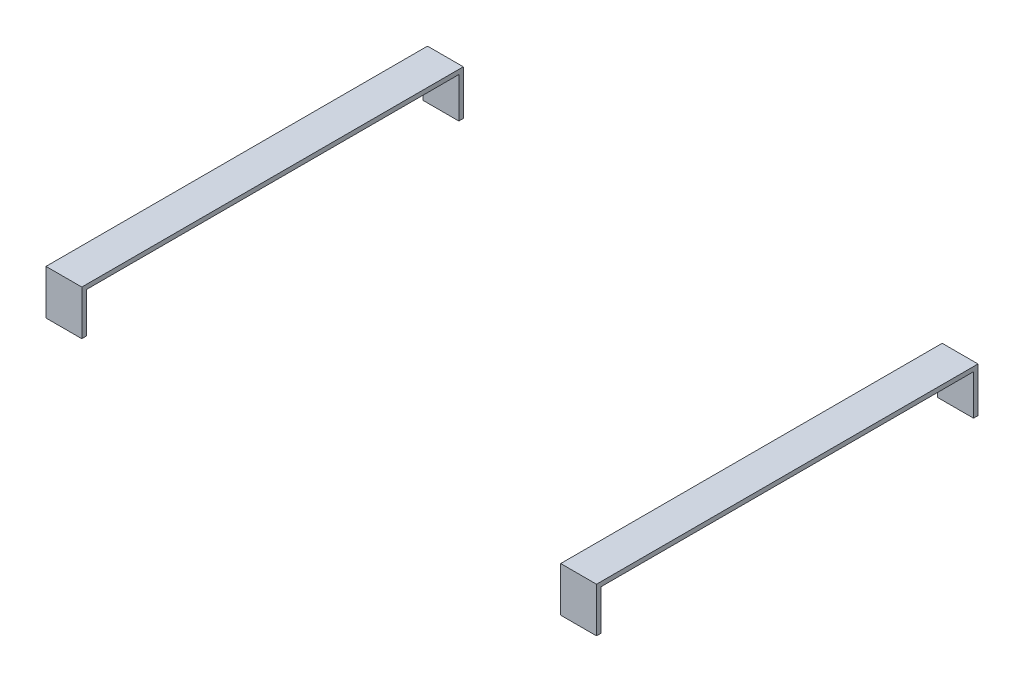
ISO-10303-21;
HEADER;
FILE_DESCRIPTION(('STEP AP214'),'2;1');
FILE_NAME('part.step','',(''),(''),'','','');
FILE_SCHEMA(('AUTOMOTIVE_DESIGN { 1 0 10303 214 1 1 1 1 }'));
ENDSEC;
DATA;
#1=APPLICATION_CONTEXT('core data for automotive mechanical design processes');
#2=APPLICATION_PROTOCOL_DEFINITION('international standard','automotive_design',2000,#1);
#3=PRODUCT_CONTEXT('',#1,'mechanical');
#4=PRODUCT('Part','Part','',(#3));
#5=PRODUCT_RELATED_PRODUCT_CATEGORY('part','',(#4));
#6=PRODUCT_DEFINITION_FORMATION('','',#4);
#7=PRODUCT_DEFINITION_CONTEXT('part definition',#1,'design');
#8=PRODUCT_DEFINITION('design','',#6,#7);
#9=PRODUCT_DEFINITION_SHAPE('','',#8);
#10=(LENGTH_UNIT() NAMED_UNIT(*) SI_UNIT(.MILLI.,.METRE.));
#11=(NAMED_UNIT(*) PLANE_ANGLE_UNIT() SI_UNIT($,.RADIAN.));
#12=(NAMED_UNIT(*) SI_UNIT($,.STERADIAN.) SOLID_ANGLE_UNIT());
#13=UNCERTAINTY_MEASURE_WITH_UNIT(LENGTH_MEASURE(1.E-05),#10,'distance_accuracy_value','');
#14=(GEOMETRIC_REPRESENTATION_CONTEXT(3) GLOBAL_UNCERTAINTY_ASSIGNED_CONTEXT((#13)) GLOBAL_UNIT_ASSIGNED_CONTEXT((#10,
#11,#12)) REPRESENTATION_CONTEXT('',''));
#15=CARTESIAN_POINT('',(0.,0.,0.));
#16=DIRECTION('',(0.,0.,1.));
#17=DIRECTION('',(1.,0.,0.));
#18=AXIS2_PLACEMENT_3D('',#15,#16,#17);
#19=CARTESIAN_POINT('',(1070.,100.,10.));
#20=DIRECTION('',(0.,0.,-1.));
#21=DIRECTION('',(-1.,0.,0.));
#22=AXIS2_PLACEMENT_3D('',#19,#20,#21);
#23=PLANE('',#22);
#24=DIRECTION('',(1.,0.,0.));
#25=VECTOR('',#24,1.);
#26=CARTESIAN_POINT('',(1070.,90.,10.));
#27=LINE('',#26,#25);
#28=CARTESIAN_POINT('',(1070.,90.,10.));
#29=VERTEX_POINT('',#28);
#30=CARTESIAN_POINT('',(1150.,90.,10.));
#31=VERTEX_POINT('',#30);
#32=EDGE_CURVE('E60',#29,#31,#27,.T.);
#33=ORIENTED_EDGE('',*,*,#32,.F.);
#34=DIRECTION('',(0.,-1.,0.));
#35=VECTOR('',#34,1.);
#36=CARTESIAN_POINT('',(1070.,100.,10.));
#37=LINE('',#36,#35);
#38=CARTESIAN_POINT('',(1070.,0.,10.));
#39=VERTEX_POINT('',#38);
#40=EDGE_CURVE('E95',#29,#39,#37,.T.);
#41=ORIENTED_EDGE('',*,*,#40,.T.);
#42=DIRECTION('',(1.,0.,0.));
#43=VECTOR('',#42,1.);
#44=CARTESIAN_POINT('',(1070.,0.,10.));
#45=LINE('',#44,#43);
#46=CARTESIAN_POINT('',(1150.,0.,10.));
#47=VERTEX_POINT('',#46);
#48=EDGE_CURVE('E99',#39,#47,#45,.T.);
#49=ORIENTED_EDGE('',*,*,#48,.T.);
#50=DIRECTION('',(0.,-1.,0.));
#51=VECTOR('',#50,1.);
#52=CARTESIAN_POINT('',(1150.,100.,10.));
#53=LINE('',#52,#51);
#54=EDGE_CURVE('E87',#31,#47,#53,.T.);
#55=ORIENTED_EDGE('',*,*,#54,.F.);
#56=EDGE_LOOP('',(#33,#41,#49,#55));
#57=FACE_BOUND('',#56,.T.);
#58=ADVANCED_FACE('F45',(#57),#23,.F.);
#59=CARTESIAN_POINT('',(1150.,100.,0.));
#60=DIRECTION('',(-1.,0.,0.));
#61=DIRECTION('',(0.,0.,1.));
#62=AXIS2_PLACEMENT_3D('',#59,#60,#61);
#63=PLANE('',#62);
#64=DIRECTION('',(0.,0.,-1.));
#65=VECTOR('',#64,1.);
#66=CARTESIAN_POINT('',(1150.,0.,0.));
#67=LINE('',#66,#65);
#68=CARTESIAN_POINT('',(1150.,0.,0.));
#69=VERTEX_POINT('',#68);
#70=EDGE_CURVE('E91',#47,#69,#67,.T.);
#71=ORIENTED_EDGE('',*,*,#70,.T.);
#72=DIRECTION('',(0.,-1.,0.));
#73=VECTOR('',#72,1.);
#74=CARTESIAN_POINT('',(1150.,100.,0.));
#75=LINE('',#74,#73);
#76=CARTESIAN_POINT('',(1150.,100.,0.));
#77=VERTEX_POINT('',#76);
#78=EDGE_CURVE('E12',#77,#69,#75,.T.);
#79=ORIENTED_EDGE('',*,*,#78,.F.);
#80=DIRECTION('',(0.,0.,-1.));
#81=VECTOR('',#80,1.);
#82=CARTESIAN_POINT('',(1150.,100.,0.));
#83=LINE('',#82,#81);
#84=CARTESIAN_POINT('',(1150.,100.,852.4));
#85=VERTEX_POINT('',#84);
#86=EDGE_CURVE('E103',#85,#77,#83,.T.);
#87=ORIENTED_EDGE('',*,*,#86,.F.);
#88=DIRECTION('',(0.,-1.,0.));
#89=VECTOR('',#88,1.);
#90=CARTESIAN_POINT('',(1150.,100.,852.4));
#91=LINE('',#90,#89);
#92=CARTESIAN_POINT('',(1150.,0.,852.4));
#93=VERTEX_POINT('',#92);
#94=EDGE_CURVE('E131',#85,#93,#91,.T.);
#95=ORIENTED_EDGE('',*,*,#94,.T.);
#96=DIRECTION('',(0.,0.,-1.));
#97=VECTOR('',#96,1.);
#98=CARTESIAN_POINT('',(1150.,0.,852.4));
#99=LINE('',#98,#97);
#100=CARTESIAN_POINT('',(1150.,0.,842.4));
#101=VERTEX_POINT('',#100);
#102=EDGE_CURVE('E179',#93,#101,#99,.T.);
#103=ORIENTED_EDGE('',*,*,#102,.T.);
#104=DIRECTION('',(0.,-1.,0.));
#105=VECTOR('',#104,1.);
#106=CARTESIAN_POINT('',(1150.,100.,842.4));
#107=LINE('',#106,#105);
#108=CARTESIAN_POINT('',(1150.,90.,842.4));
#109=VERTEX_POINT('',#108);
#110=EDGE_CURVE('E149',#109,#101,#107,.T.);
#111=ORIENTED_EDGE('',*,*,#110,.F.);
#112=DIRECTION('',(0.,0.,-1.));
#113=VECTOR('',#112,1.);
#114=CARTESIAN_POINT('',(1150.,90.,923.022577482986));
#115=LINE('',#114,#113);
#116=EDGE_CURVE('E94',#109,#31,#115,.T.);
#117=ORIENTED_EDGE('',*,*,#116,.T.);
#118=ORIENTED_EDGE('',*,*,#54,.T.);
#119=EDGE_LOOP('',(#71,#79,#87,#95,#103,#111,#117,#118));
#120=FACE_BOUND('',#119,.T.);
#121=ADVANCED_FACE('F47',(#120),#63,.F.);
#122=CARTESIAN_POINT('',(1070.,100.,0.));
#123=DIRECTION('',(0.,0.,1.));
#124=DIRECTION('',(1.,0.,0.));
#125=AXIS2_PLACEMENT_3D('',#122,#123,#124);
#126=PLANE('',#125);
#127=DIRECTION('',(-1.,0.,0.));
#128=VECTOR('',#127,1.);
#129=CARTESIAN_POINT('',(1070.,0.,0.));
#130=LINE('',#129,#128);
#131=CARTESIAN_POINT('',(1070.,0.,0.));
#132=VERTEX_POINT('',#131);
#133=EDGE_CURVE('E107',#69,#132,#130,.T.);
#134=ORIENTED_EDGE('',*,*,#133,.T.);
#135=DIRECTION('',(0.,-1.,0.));
#136=VECTOR('',#135,1.);
#137=CARTESIAN_POINT('',(1070.,100.,0.));
#138=LINE('',#137,#136);
#139=CARTESIAN_POINT('',(1070.,100.,0.));
#140=VERTEX_POINT('',#139);
#141=EDGE_CURVE('E53',#140,#132,#138,.T.);
#142=ORIENTED_EDGE('',*,*,#141,.F.);
#143=DIRECTION('',(-1.,0.,0.));
#144=VECTOR('',#143,1.);
#145=CARTESIAN_POINT('',(1070.,100.,0.));
#146=LINE('',#145,#144);
#147=EDGE_CURVE('E69',#77,#140,#146,.T.);
#148=ORIENTED_EDGE('',*,*,#147,.F.);
#149=ORIENTED_EDGE('',*,*,#78,.T.);
#150=EDGE_LOOP('',(#134,#142,#148,#149));
#151=FACE_BOUND('',#150,.T.);
#152=ADVANCED_FACE('F123',(#151),#126,.F.);
#153=CARTESIAN_POINT('',(1070.,100.,0.));
#154=DIRECTION('',(1.,0.,0.));
#155=DIRECTION('',(0.,0.,-1.));
#156=AXIS2_PLACEMENT_3D('',#153,#154,#155);
#157=PLANE('',#156);
#158=DIRECTION('',(0.,0.,1.));
#159=VECTOR('',#158,1.);
#160=CARTESIAN_POINT('',(1070.,0.,0.));
#161=LINE('',#160,#159);
#162=EDGE_CURVE('E104',#132,#39,#161,.T.);
#163=ORIENTED_EDGE('',*,*,#162,.T.);
#164=ORIENTED_EDGE('',*,*,#40,.F.);
#165=DIRECTION('',(0.,0.,-1.));
#166=VECTOR('',#165,1.);
#167=CARTESIAN_POINT('',(1070.,90.,923.022577482986));
#168=LINE('',#167,#166);
#169=CARTESIAN_POINT('',(1070.,90.,842.4));
#170=VERTEX_POINT('',#169);
#171=EDGE_CURVE('E148',#170,#29,#168,.T.);
#172=ORIENTED_EDGE('',*,*,#171,.F.);
#173=DIRECTION('',(0.,-1.,0.));
#174=VECTOR('',#173,1.);
#175=CARTESIAN_POINT('',(1070.,100.,842.4));
#176=LINE('',#175,#174);
#177=CARTESIAN_POINT('',(1070.,0.,842.4));
#178=VERTEX_POINT('',#177);
#179=EDGE_CURVE('E154',#170,#178,#176,.T.);
#180=ORIENTED_EDGE('',*,*,#179,.T.);
#181=DIRECTION('',(0.,0.,1.));
#182=VECTOR('',#181,1.);
#183=CARTESIAN_POINT('',(1070.,0.,852.4));
#184=LINE('',#183,#182);
#185=CARTESIAN_POINT('',(1070.,0.,852.4));
#186=VERTEX_POINT('',#185);
#187=EDGE_CURVE('E143',#178,#186,#184,.T.);
#188=ORIENTED_EDGE('',*,*,#187,.T.);
#189=DIRECTION('',(0.,-1.,0.));
#190=VECTOR('',#189,1.);
#191=CARTESIAN_POINT('',(1070.,100.,852.4));
#192=LINE('',#191,#190);
#193=CARTESIAN_POINT('',(1070.,100.,852.4));
#194=VERTEX_POINT('',#193);
#195=EDGE_CURVE('E142',#194,#186,#192,.T.);
#196=ORIENTED_EDGE('',*,*,#195,.F.);
#197=DIRECTION('',(0.,0.,1.));
#198=VECTOR('',#197,1.);
#199=CARTESIAN_POINT('',(1070.,100.,0.));
#200=LINE('',#199,#198);
#201=EDGE_CURVE('E96',#140,#194,#200,.T.);
#202=ORIENTED_EDGE('',*,*,#201,.F.);
#203=ORIENTED_EDGE('',*,*,#141,.T.);
#204=EDGE_LOOP('',(#163,#164,#172,#180,#188,#196,#202,#203));
#205=FACE_BOUND('',#204,.T.);
#206=ADVANCED_FACE('F120',(#205),#157,.F.);
#207=CARTESIAN_POINT('',(0.,100.,0.));
#208=DIRECTION('',(0.,1.,0.));
#209=DIRECTION('',(0.,0.,1.));
#210=AXIS2_PLACEMENT_3D('',#207,#208,#209);
#211=PLANE('',#210);
#212=ORIENTED_EDGE('',*,*,#86,.T.);
#213=ORIENTED_EDGE('',*,*,#147,.T.);
#214=ORIENTED_EDGE('',*,*,#201,.T.);
#215=DIRECTION('',(1.,0.,0.));
#216=VECTOR('',#215,1.);
#217=CARTESIAN_POINT('',(1070.,100.,852.4));
#218=LINE('',#217,#216);
#219=EDGE_CURVE('E138',#194,#85,#218,.T.);
#220=ORIENTED_EDGE('',*,*,#219,.T.);
#221=EDGE_LOOP('',(#212,#213,#214,#220));
#222=FACE_BOUND('',#221,.T.);
#223=ADVANCED_FACE('F139',(#222),#211,.T.);
#224=CARTESIAN_POINT('',(0.,0.,0.));
#225=DIRECTION('',(0.,1.,0.));
#226=DIRECTION('',(0.,0.,1.));
#227=AXIS2_PLACEMENT_3D('',#224,#225,#226);
#228=PLANE('',#227);
#229=ORIENTED_EDGE('',*,*,#70,.F.);
#230=ORIENTED_EDGE('',*,*,#48,.F.);
#231=ORIENTED_EDGE('',*,*,#162,.F.);
#232=ORIENTED_EDGE('',*,*,#133,.F.);
#233=EDGE_LOOP('',(#229,#230,#231,#232));
#234=FACE_BOUND('',#233,.T.);
#235=ADVANCED_FACE('F106',(#234),#228,.F.);
#236=CARTESIAN_POINT('',(1070.,90.,923.022577482986));
#237=DIRECTION('',(0.,1.,0.));
#238=DIRECTION('',(0.,0.,1.));
#239=AXIS2_PLACEMENT_3D('',#236,#237,#238);
#240=PLANE('',#239);
#241=DIRECTION('',(1.,0.,0.));
#242=VECTOR('',#241,1.);
#243=CARTESIAN_POINT('',(1070.,90.,842.4));
#244=LINE('',#243,#242);
#245=EDGE_CURVE('E108',#170,#109,#244,.T.);
#246=ORIENTED_EDGE('',*,*,#245,.F.);
#247=ORIENTED_EDGE('',*,*,#171,.T.);
#248=ORIENTED_EDGE('',*,*,#32,.T.);
#249=ORIENTED_EDGE('',*,*,#116,.F.);
#250=EDGE_LOOP('',(#246,#247,#248,#249));
#251=FACE_BOUND('',#250,.T.);
#252=ADVANCED_FACE('F161',(#251),#240,.F.);
#253=CARTESIAN_POINT('',(1070.,100.,842.4));
#254=DIRECTION('',(0.,0.,1.));
#255=DIRECTION('',(1.,0.,0.));
#256=AXIS2_PLACEMENT_3D('',#253,#254,#255);
#257=PLANE('',#256);
#258=ORIENTED_EDGE('',*,*,#179,.F.);
#259=ORIENTED_EDGE('',*,*,#245,.T.);
#260=ORIENTED_EDGE('',*,*,#110,.T.);
#261=DIRECTION('',(-1.,0.,0.));
#262=VECTOR('',#261,1.);
#263=CARTESIAN_POINT('',(1070.,0.,842.4));
#264=LINE('',#263,#262);
#265=EDGE_CURVE('E183',#101,#178,#264,.T.);
#266=ORIENTED_EDGE('',*,*,#265,.T.);
#267=EDGE_LOOP('',(#258,#259,#260,#266));
#268=FACE_BOUND('',#267,.T.);
#269=ADVANCED_FACE('F191',(#268),#257,.F.);
#270=CARTESIAN_POINT('',(1070.,100.,852.4));
#271=DIRECTION('',(0.,0.,-1.));
#272=DIRECTION('',(-1.,0.,0.));
#273=AXIS2_PLACEMENT_3D('',#270,#271,#272);
#274=PLANE('',#273);
#275=DIRECTION('',(1.,0.,0.));
#276=VECTOR('',#275,1.);
#277=CARTESIAN_POINT('',(1070.,0.,852.4));
#278=LINE('',#277,#276);
#279=EDGE_CURVE('E147',#186,#93,#278,.T.);
#280=ORIENTED_EDGE('',*,*,#279,.T.);
#281=ORIENTED_EDGE('',*,*,#94,.F.);
#282=ORIENTED_EDGE('',*,*,#219,.F.);
#283=ORIENTED_EDGE('',*,*,#195,.T.);
#284=EDGE_LOOP('',(#280,#281,#282,#283));
#285=FACE_BOUND('',#284,.T.);
#286=ADVANCED_FACE('F145',(#285),#274,.F.);
#287=CARTESIAN_POINT('',(0.,0.,0.));
#288=DIRECTION('',(0.,1.,0.));
#289=DIRECTION('',(0.,0.,1.));
#290=AXIS2_PLACEMENT_3D('',#287,#288,#289);
#291=PLANE('',#290);
#292=ORIENTED_EDGE('',*,*,#279,.F.);
#293=ORIENTED_EDGE('',*,*,#187,.F.);
#294=ORIENTED_EDGE('',*,*,#265,.F.);
#295=ORIENTED_EDGE('',*,*,#102,.F.);
#296=EDGE_LOOP('',(#292,#293,#294,#295));
#297=FACE_BOUND('',#296,.T.);
#298=ADVANCED_FACE('F180',(#297),#291,.F.);
#299=CLOSED_SHELL('',(#58,#121,#152,#206,#223,#235,#252,#269,#286,#298));
#300=MANIFOLD_SOLID_BREP('B2',#299);
#301=CARTESIAN_POINT('',(0.,100.,10.));
#302=DIRECTION('',(0.,0.,-1.));
#303=DIRECTION('',(-1.,0.,0.));
#304=AXIS2_PLACEMENT_3D('',#301,#302,#303);
#305=PLANE('',#304);
#306=DIRECTION('',(1.,0.,0.));
#307=VECTOR('',#306,1.);
#308=CARTESIAN_POINT('',(-80.,90.,10.));
#309=LINE('',#308,#307);
#310=CARTESIAN_POINT('',(-80.,90.,10.));
#311=VERTEX_POINT('',#310);
#312=CARTESIAN_POINT('',(0.,90.,10.));
#313=VERTEX_POINT('',#312);
#314=EDGE_CURVE('E306',#311,#313,#309,.T.);
#315=ORIENTED_EDGE('',*,*,#314,.F.);
#316=DIRECTION('',(0.,-1.,0.));
#317=VECTOR('',#316,1.);
#318=CARTESIAN_POINT('',(-80.,100.,10.));
#319=LINE('',#318,#317);
#320=CARTESIAN_POINT('',(-80.,0.,10.));
#321=VERTEX_POINT('',#320);
#322=EDGE_CURVE('E341',#311,#321,#319,.T.);
#323=ORIENTED_EDGE('',*,*,#322,.T.);
#324=DIRECTION('',(1.,0.,0.));
#325=VECTOR('',#324,1.);
#326=CARTESIAN_POINT('',(0.,0.,10.));
#327=LINE('',#326,#325);
#328=CARTESIAN_POINT('',(0.,0.,10.));
#329=VERTEX_POINT('',#328);
#330=EDGE_CURVE('E345',#321,#329,#327,.T.);
#331=ORIENTED_EDGE('',*,*,#330,.T.);
#332=DIRECTION('',(0.,-1.,0.));
#333=VECTOR('',#332,1.);
#334=CARTESIAN_POINT('',(0.,100.,10.));
#335=LINE('',#334,#333);
#336=EDGE_CURVE('E333',#313,#329,#335,.T.);
#337=ORIENTED_EDGE('',*,*,#336,.F.);
#338=EDGE_LOOP('',(#315,#323,#331,#337));
#339=FACE_BOUND('',#338,.T.);
#340=ADVANCED_FACE('F291',(#339),#305,.F.);
#341=CARTESIAN_POINT('',(0.,100.,0.));
#342=DIRECTION('',(-1.,0.,0.));
#343=DIRECTION('',(0.,0.,1.));
#344=AXIS2_PLACEMENT_3D('',#341,#342,#343);
#345=PLANE('',#344);
#346=DIRECTION('',(0.,0.,-1.));
#347=VECTOR('',#346,1.);
#348=CARTESIAN_POINT('',(0.,0.,0.));
#349=LINE('',#348,#347);
#350=CARTESIAN_POINT('',(0.,0.,0.));
#351=VERTEX_POINT('',#350);
#352=EDGE_CURVE('E337',#329,#351,#349,.T.);
#353=ORIENTED_EDGE('',*,*,#352,.T.);
#354=DIRECTION('',(0.,-1.,0.));
#355=VECTOR('',#354,1.);
#356=CARTESIAN_POINT('',(0.,100.,0.));
#357=LINE('',#356,#355);
#358=CARTESIAN_POINT('',(0.,100.,0.));
#359=VERTEX_POINT('',#358);
#360=EDGE_CURVE('E43',#359,#351,#357,.T.);
#361=ORIENTED_EDGE('',*,*,#360,.F.);
#362=DIRECTION('',(0.,0.,-1.));
#363=VECTOR('',#362,1.);
#364=CARTESIAN_POINT('',(0.,100.,0.));
#365=LINE('',#364,#363);
#366=CARTESIAN_POINT('',(0.,100.,852.4));
#367=VERTEX_POINT('',#366);
#368=EDGE_CURVE('E349',#367,#359,#365,.T.);
#369=ORIENTED_EDGE('',*,*,#368,.F.);
#370=DIRECTION('',(0.,-1.,0.));
#371=VECTOR('',#370,1.);
#372=CARTESIAN_POINT('',(0.,100.,852.4));
#373=LINE('',#372,#371);
#374=CARTESIAN_POINT('',(0.,0.,852.4));
#375=VERTEX_POINT('',#374);
#376=EDGE_CURVE('E377',#367,#375,#373,.T.);
#377=ORIENTED_EDGE('',*,*,#376,.T.);
#378=DIRECTION('',(0.,0.,-1.));
#379=VECTOR('',#378,1.);
#380=CARTESIAN_POINT('',(0.,0.,852.4));
#381=LINE('',#380,#379);
#382=CARTESIAN_POINT('',(0.,0.,842.4));
#383=VERTEX_POINT('',#382);
#384=EDGE_CURVE('E425',#375,#383,#381,.T.);
#385=ORIENTED_EDGE('',*,*,#384,.T.);
#386=DIRECTION('',(0.,-1.,0.));
#387=VECTOR('',#386,1.);
#388=CARTESIAN_POINT('',(0.,100.,842.4));
#389=LINE('',#388,#387);
#390=CARTESIAN_POINT('',(0.,90.,842.4));
#391=VERTEX_POINT('',#390);
#392=EDGE_CURVE('E395',#391,#383,#389,.T.);
#393=ORIENTED_EDGE('',*,*,#392,.F.);
#394=DIRECTION('',(0.,0.,-1.));
#395=VECTOR('',#394,1.);
#396=CARTESIAN_POINT('',(0.,90.,923.022577482986));
#397=LINE('',#396,#395);
#398=EDGE_CURVE('E340',#391,#313,#397,.T.);
#399=ORIENTED_EDGE('',*,*,#398,.T.);
#400=ORIENTED_EDGE('',*,*,#336,.T.);
#401=EDGE_LOOP('',(#353,#361,#369,#377,#385,#393,#399,#400));
#402=FACE_BOUND('',#401,.T.);
#403=ADVANCED_FACE('F293',(#402),#345,.F.);
#404=CARTESIAN_POINT('',(0.,100.,0.));
#405=DIRECTION('',(0.,0.,1.));
#406=DIRECTION('',(1.,0.,0.));
#407=AXIS2_PLACEMENT_3D('',#404,#405,#406);
#408=PLANE('',#407);
#409=DIRECTION('',(-1.,0.,0.));
#410=VECTOR('',#409,1.);
#411=CARTESIAN_POINT('',(0.,0.,0.));
#412=LINE('',#411,#410);
#413=CARTESIAN_POINT('',(-80.,0.,0.));
#414=VERTEX_POINT('',#413);
#415=EDGE_CURVE('E353',#351,#414,#412,.T.);
#416=ORIENTED_EDGE('',*,*,#415,.T.);
#417=DIRECTION('',(0.,-1.,0.));
#418=VECTOR('',#417,1.);
#419=CARTESIAN_POINT('',(-80.,100.,0.));
#420=LINE('',#419,#418);
#421=CARTESIAN_POINT('',(-80.,100.,0.));
#422=VERTEX_POINT('',#421);
#423=EDGE_CURVE('E299',#422,#414,#420,.T.);
#424=ORIENTED_EDGE('',*,*,#423,.F.);
#425=DIRECTION('',(-1.,0.,0.));
#426=VECTOR('',#425,1.);
#427=CARTESIAN_POINT('',(0.,100.,0.));
#428=LINE('',#427,#426);
#429=EDGE_CURVE('E315',#359,#422,#428,.T.);
#430=ORIENTED_EDGE('',*,*,#429,.F.);
#431=ORIENTED_EDGE('',*,*,#360,.T.);
#432=EDGE_LOOP('',(#416,#424,#430,#431));
#433=FACE_BOUND('',#432,.T.);
#434=ADVANCED_FACE('F369',(#433),#408,.F.);
#435=CARTESIAN_POINT('',(-80.,100.,0.));
#436=DIRECTION('',(1.,0.,0.));
#437=DIRECTION('',(0.,0.,-1.));
#438=AXIS2_PLACEMENT_3D('',#435,#436,#437);
#439=PLANE('',#438);
#440=DIRECTION('',(0.,0.,1.));
#441=VECTOR('',#440,1.);
#442=CARTESIAN_POINT('',(-80.,0.,0.));
#443=LINE('',#442,#441);
#444=EDGE_CURVE('E350',#414,#321,#443,.T.);
#445=ORIENTED_EDGE('',*,*,#444,.T.);
#446=ORIENTED_EDGE('',*,*,#322,.F.);
#447=DIRECTION('',(0.,0.,-1.));
#448=VECTOR('',#447,1.);
#449=CARTESIAN_POINT('',(-80.,90.,923.022577482986));
#450=LINE('',#449,#448);
#451=CARTESIAN_POINT('',(-80.,90.,842.4));
#452=VERTEX_POINT('',#451);
#453=EDGE_CURVE('E394',#452,#311,#450,.T.);
#454=ORIENTED_EDGE('',*,*,#453,.F.);
#455=DIRECTION('',(0.,-1.,0.));
#456=VECTOR('',#455,1.);
#457=CARTESIAN_POINT('',(-80.,100.,842.4));
#458=LINE('',#457,#456);
#459=CARTESIAN_POINT('',(-80.,0.,842.4));
#460=VERTEX_POINT('',#459);
#461=EDGE_CURVE('E400',#452,#460,#458,.T.);
#462=ORIENTED_EDGE('',*,*,#461,.T.);
#463=DIRECTION('',(0.,0.,1.));
#464=VECTOR('',#463,1.);
#465=CARTESIAN_POINT('',(-80.,0.,852.4));
#466=LINE('',#465,#464);
#467=CARTESIAN_POINT('',(-80.,0.,852.4));
#468=VERTEX_POINT('',#467);
#469=EDGE_CURVE('E389',#460,#468,#466,.T.);
#470=ORIENTED_EDGE('',*,*,#469,.T.);
#471=DIRECTION('',(0.,-1.,0.));
#472=VECTOR('',#471,1.);
#473=CARTESIAN_POINT('',(-80.,100.,852.4));
#474=LINE('',#473,#472);
#475=CARTESIAN_POINT('',(-80.,100.,852.4));
#476=VERTEX_POINT('',#475);
#477=EDGE_CURVE('E388',#476,#468,#474,.T.);
#478=ORIENTED_EDGE('',*,*,#477,.F.);
#479=DIRECTION('',(0.,0.,1.));
#480=VECTOR('',#479,1.);
#481=CARTESIAN_POINT('',(-80.,100.,0.));
#482=LINE('',#481,#480);
#483=EDGE_CURVE('E342',#422,#476,#482,.T.);
#484=ORIENTED_EDGE('',*,*,#483,.F.);
#485=ORIENTED_EDGE('',*,*,#423,.T.);
#486=EDGE_LOOP('',(#445,#446,#454,#462,#470,#478,#484,#485));
#487=FACE_BOUND('',#486,.T.);
#488=ADVANCED_FACE('F366',(#487),#439,.F.);
#489=CARTESIAN_POINT('',(0.,100.,0.));
#490=DIRECTION('',(0.,-1.,0.));
#491=DIRECTION('',(0.,0.,-1.));
#492=AXIS2_PLACEMENT_3D('',#489,#490,#491);
#493=PLANE('',#492);
#494=ORIENTED_EDGE('',*,*,#368,.T.);
#495=ORIENTED_EDGE('',*,*,#429,.T.);
#496=ORIENTED_EDGE('',*,*,#483,.T.);
#497=DIRECTION('',(1.,0.,0.));
#498=VECTOR('',#497,1.);
#499=CARTESIAN_POINT('',(0.,100.,852.4));
#500=LINE('',#499,#498);
#501=EDGE_CURVE('E384',#476,#367,#500,.T.);
#502=ORIENTED_EDGE('',*,*,#501,.T.);
#503=EDGE_LOOP('',(#494,#495,#496,#502));
#504=FACE_BOUND('',#503,.T.);
#505=ADVANCED_FACE('F385',(#504),#493,.F.);
#506=CARTESIAN_POINT('',(0.,0.,0.));
#507=DIRECTION('',(0.,-1.,0.));
#508=DIRECTION('',(0.,0.,-1.));
#509=AXIS2_PLACEMENT_3D('',#506,#507,#508);
#510=PLANE('',#509);
#511=ORIENTED_EDGE('',*,*,#352,.F.);
#512=ORIENTED_EDGE('',*,*,#330,.F.);
#513=ORIENTED_EDGE('',*,*,#444,.F.);
#514=ORIENTED_EDGE('',*,*,#415,.F.);
#515=EDGE_LOOP('',(#511,#512,#513,#514));
#516=FACE_BOUND('',#515,.T.);
#517=ADVANCED_FACE('F352',(#516),#510,.T.);
#518=CARTESIAN_POINT('',(-80.,90.,923.022577482986));
#519=DIRECTION('',(0.,1.,0.));
#520=DIRECTION('',(0.,0.,1.));
#521=AXIS2_PLACEMENT_3D('',#518,#519,#520);
#522=PLANE('',#521);
#523=DIRECTION('',(1.,0.,0.));
#524=VECTOR('',#523,1.);
#525=CARTESIAN_POINT('',(-80.,90.,842.4));
#526=LINE('',#525,#524);
#527=EDGE_CURVE('E354',#452,#391,#526,.T.);
#528=ORIENTED_EDGE('',*,*,#527,.F.);
#529=ORIENTED_EDGE('',*,*,#453,.T.);
#530=ORIENTED_EDGE('',*,*,#314,.T.);
#531=ORIENTED_EDGE('',*,*,#398,.F.);
#532=EDGE_LOOP('',(#528,#529,#530,#531));
#533=FACE_BOUND('',#532,.T.);
#534=ADVANCED_FACE('F407',(#533),#522,.F.);
#535=CARTESIAN_POINT('',(0.,100.,842.4));
#536=DIRECTION('',(0.,0.,1.));
#537=DIRECTION('',(1.,0.,0.));
#538=AXIS2_PLACEMENT_3D('',#535,#536,#537);
#539=PLANE('',#538);
#540=ORIENTED_EDGE('',*,*,#461,.F.);
#541=ORIENTED_EDGE('',*,*,#527,.T.);
#542=ORIENTED_EDGE('',*,*,#392,.T.);
#543=DIRECTION('',(-1.,0.,0.));
#544=VECTOR('',#543,1.);
#545=CARTESIAN_POINT('',(0.,0.,842.4));
#546=LINE('',#545,#544);
#547=EDGE_CURVE('E429',#383,#460,#546,.T.);
#548=ORIENTED_EDGE('',*,*,#547,.T.);
#549=EDGE_LOOP('',(#540,#541,#542,#548));
#550=FACE_BOUND('',#549,.T.);
#551=ADVANCED_FACE('F437',(#550),#539,.F.);
#552=CARTESIAN_POINT('',(0.,100.,852.4));
#553=DIRECTION('',(0.,0.,-1.));
#554=DIRECTION('',(-1.,0.,0.));
#555=AXIS2_PLACEMENT_3D('',#552,#553,#554);
#556=PLANE('',#555);
#557=DIRECTION('',(1.,0.,0.));
#558=VECTOR('',#557,1.);
#559=CARTESIAN_POINT('',(0.,0.,852.4));
#560=LINE('',#559,#558);
#561=EDGE_CURVE('E393',#468,#375,#560,.T.);
#562=ORIENTED_EDGE('',*,*,#561,.T.);
#563=ORIENTED_EDGE('',*,*,#376,.F.);
#564=ORIENTED_EDGE('',*,*,#501,.F.);
#565=ORIENTED_EDGE('',*,*,#477,.T.);
#566=EDGE_LOOP('',(#562,#563,#564,#565));
#567=FACE_BOUND('',#566,.T.);
#568=ADVANCED_FACE('F391',(#567),#556,.F.);
#569=CARTESIAN_POINT('',(0.,0.,0.));
#570=DIRECTION('',(0.,-1.,0.));
#571=DIRECTION('',(0.,0.,-1.));
#572=AXIS2_PLACEMENT_3D('',#569,#570,#571);
#573=PLANE('',#572);
#574=ORIENTED_EDGE('',*,*,#561,.F.);
#575=ORIENTED_EDGE('',*,*,#469,.F.);
#576=ORIENTED_EDGE('',*,*,#547,.F.);
#577=ORIENTED_EDGE('',*,*,#384,.F.);
#578=EDGE_LOOP('',(#574,#575,#576,#577));
#579=FACE_BOUND('',#578,.T.);
#580=ADVANCED_FACE('F426',(#579),#573,.T.);
#581=CLOSED_SHELL('',(#340,#403,#434,#488,#505,#517,#534,#551,#568,#580));
#582=MANIFOLD_SOLID_BREP('B6',#581);
#583=ADVANCED_BREP_SHAPE_REPRESENTATION('',(#18,#300,#582),#14);
#584=SHAPE_DEFINITION_REPRESENTATION(#9,#583);
ENDSEC;
END-ISO-10303-21;
